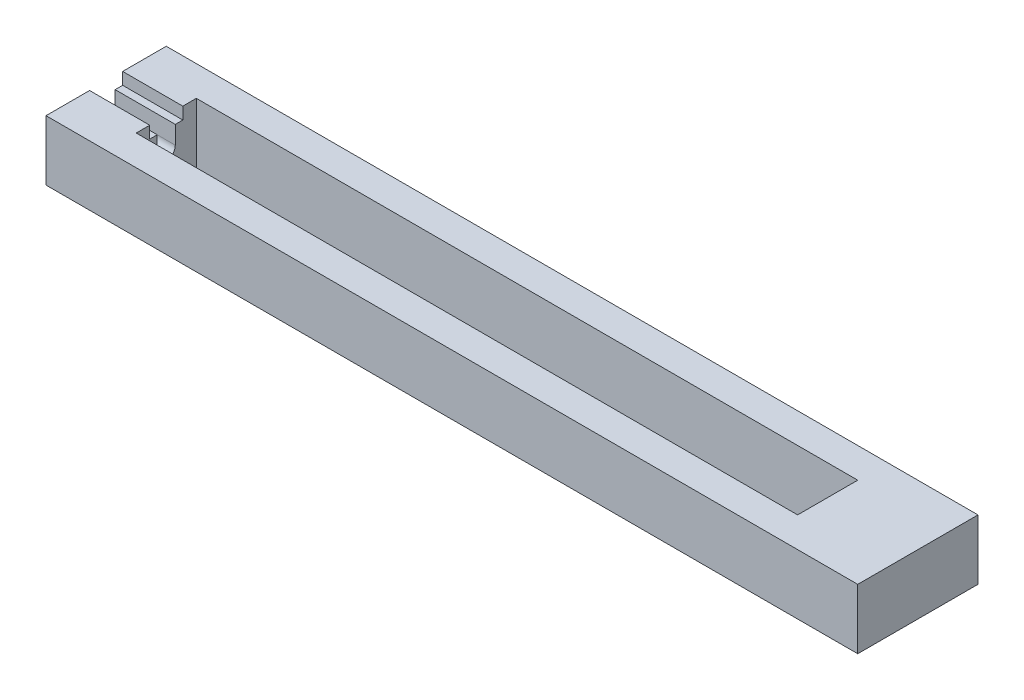
ISO-10303-21;
HEADER;
FILE_DESCRIPTION(('STEP AP214'),'2;1');
FILE_NAME('part.step','',(''),(''),'','','');
FILE_SCHEMA(('AUTOMOTIVE_DESIGN { 1 0 10303 214 1 1 1 1 }'));
ENDSEC;
DATA;
#1=APPLICATION_CONTEXT('core data for automotive mechanical design processes');
#2=APPLICATION_PROTOCOL_DEFINITION('international standard','automotive_design',2000,#1);
#3=PRODUCT_CONTEXT('',#1,'mechanical');
#4=PRODUCT('Part','Part','',(#3));
#5=PRODUCT_RELATED_PRODUCT_CATEGORY('part','',(#4));
#6=PRODUCT_DEFINITION_FORMATION('','',#4);
#7=PRODUCT_DEFINITION_CONTEXT('part definition',#1,'design');
#8=PRODUCT_DEFINITION('design','',#6,#7);
#9=PRODUCT_DEFINITION_SHAPE('','',#8);
#10=(LENGTH_UNIT() NAMED_UNIT(*) SI_UNIT(.MILLI.,.METRE.));
#11=(NAMED_UNIT(*) PLANE_ANGLE_UNIT() SI_UNIT($,.RADIAN.));
#12=(NAMED_UNIT(*) SI_UNIT($,.STERADIAN.) SOLID_ANGLE_UNIT());
#13=UNCERTAINTY_MEASURE_WITH_UNIT(LENGTH_MEASURE(1.E-05),#10,'distance_accuracy_value','');
#14=(GEOMETRIC_REPRESENTATION_CONTEXT(3) GLOBAL_UNCERTAINTY_ASSIGNED_CONTEXT((#13)) GLOBAL_UNIT_ASSIGNED_CONTEXT((#10,
#11,#12)) REPRESENTATION_CONTEXT('',''));
#15=CARTESIAN_POINT('',(0.,0.,0.));
#16=DIRECTION('',(0.,0.,1.));
#17=DIRECTION('',(1.,0.,0.));
#18=AXIS2_PLACEMENT_3D('',#15,#16,#17);
#19=CARTESIAN_POINT('',(0.,1.,0.));
#20=DIRECTION('',(0.,-1.,0.));
#21=DIRECTION('',(0.,0.,-1.));
#22=AXIS2_PLACEMENT_3D('',#19,#20,#21);
#23=PLANE('',#22);
#24=DIRECTION('',(-1.,0.,0.));
#25=VECTOR('',#24,1.);
#26=CARTESIAN_POINT('',(-5.75,1.,-0.275));
#27=LINE('',#26,#25);
#28=CARTESIAN_POINT('',(-5.75,1.,-0.275));
#29=VERTEX_POINT('',#28);
#30=CARTESIAN_POINT('',(-6.75,1.,-0.275));
#31=VERTEX_POINT('',#30);
#32=EDGE_CURVE('E202',#29,#31,#27,.T.);
#33=ORIENTED_EDGE('',*,*,#32,.F.);
#34=DIRECTION('',(0.,0.,1.));
#35=VECTOR('',#34,1.);
#36=CARTESIAN_POINT('',(-5.75,1.,-0.5));
#37=LINE('',#36,#35);
#38=CARTESIAN_POINT('',(-5.75,1.,-0.5));
#39=VERTEX_POINT('',#38);
#40=EDGE_CURVE('E217',#39,#29,#37,.T.);
#41=ORIENTED_EDGE('',*,*,#40,.F.);
#42=DIRECTION('',(-1.,0.,0.));
#43=VECTOR('',#42,1.);
#44=CARTESIAN_POINT('',(-5.75,1.,-0.5));
#45=LINE('',#44,#43);
#46=CARTESIAN_POINT('',(5.25,1.,-0.5));
#47=VERTEX_POINT('',#46);
#48=EDGE_CURVE('E214',#47,#39,#45,.T.);
#49=ORIENTED_EDGE('',*,*,#48,.F.);
#50=DIRECTION('',(0.,0.,-1.));
#51=VECTOR('',#50,1.);
#52=CARTESIAN_POINT('',(5.25,1.,-0.5));
#53=LINE('',#52,#51);
#54=CARTESIAN_POINT('',(5.25,1.,0.5));
#55=VERTEX_POINT('',#54);
#56=EDGE_CURVE('E212',#55,#47,#53,.T.);
#57=ORIENTED_EDGE('',*,*,#56,.F.);
#58=DIRECTION('',(1.,0.,0.));
#59=VECTOR('',#58,1.);
#60=CARTESIAN_POINT('',(-5.75,1.,0.5));
#61=LINE('',#60,#59);
#62=CARTESIAN_POINT('',(-5.75,1.,0.5));
#63=VERTEX_POINT('',#62);
#64=EDGE_CURVE('E219',#63,#55,#61,.T.);
#65=ORIENTED_EDGE('',*,*,#64,.F.);
#66=CARTESIAN_POINT('',(-5.75,1.,0.275));
#67=VERTEX_POINT('',#66);
#68=EDGE_CURVE('E56',#67,#63,#37,.T.);
#69=ORIENTED_EDGE('',*,*,#68,.F.);
#70=DIRECTION('',(-1.,0.,0.));
#71=VECTOR('',#70,1.);
#72=CARTESIAN_POINT('',(-5.75,1.,0.275));
#73=LINE('',#72,#71);
#74=CARTESIAN_POINT('',(-6.75,1.,0.275));
#75=VERTEX_POINT('',#74);
#76=EDGE_CURVE('E204',#67,#75,#73,.T.);
#77=ORIENTED_EDGE('',*,*,#76,.T.);
#78=DIRECTION('',(0.,0.,1.));
#79=VECTOR('',#78,1.);
#80=CARTESIAN_POINT('',(-6.75,1.,1.));
#81=LINE('',#80,#79);
#82=CARTESIAN_POINT('',(-6.75,1.,1.));
#83=VERTEX_POINT('',#82);
#84=EDGE_CURVE('E248',#75,#83,#81,.T.);
#85=ORIENTED_EDGE('',*,*,#84,.T.);
#86=DIRECTION('',(1.,0.,0.));
#87=VECTOR('',#86,1.);
#88=CARTESIAN_POINT('',(-6.75,1.,1.));
#89=LINE('',#88,#87);
#90=CARTESIAN_POINT('',(6.75,1.,1.));
#91=VERTEX_POINT('',#90);
#92=EDGE_CURVE('E252',#83,#91,#89,.T.);
#93=ORIENTED_EDGE('',*,*,#92,.T.);
#94=DIRECTION('',(0.,0.,-1.));
#95=VECTOR('',#94,1.);
#96=CARTESIAN_POINT('',(6.75,1.,1.));
#97=LINE('',#96,#95);
#98=CARTESIAN_POINT('',(6.75,1.,-1.));
#99=VERTEX_POINT('',#98);
#100=EDGE_CURVE('E242',#91,#99,#97,.T.);
#101=ORIENTED_EDGE('',*,*,#100,.T.);
#102=DIRECTION('',(-1.,0.,0.));
#103=VECTOR('',#102,1.);
#104=CARTESIAN_POINT('',(-6.75,1.,-1.));
#105=LINE('',#104,#103);
#106=CARTESIAN_POINT('',(-6.75,1.,-1.));
#107=VERTEX_POINT('',#106);
#108=EDGE_CURVE('E245',#99,#107,#105,.T.);
#109=ORIENTED_EDGE('',*,*,#108,.T.);
#110=EDGE_CURVE('E249',#107,#31,#81,.T.);
#111=ORIENTED_EDGE('',*,*,#110,.T.);
#112=EDGE_LOOP('',(#33,#41,#49,#57,#65,#69,#77,#85,#93,#101,#109,#111));
#113=FACE_BOUND('',#112,.T.);
#114=ADVANCED_FACE('F33',(#113),#23,.F.);
#115=CARTESIAN_POINT('',(-6.75,1.,1.));
#116=DIRECTION('',(1.,0.,0.));
#117=DIRECTION('',(0.,0.,-1.));
#118=AXIS2_PLACEMENT_3D('',#115,#116,#117);
#119=PLANE('',#118);
#120=DIRECTION('',(0.,1.,0.));
#121=VECTOR('',#120,1.);
#122=CARTESIAN_POINT('',(-6.75,0.,-0.275));
#123=LINE('',#122,#121);
#124=CARTESIAN_POINT('',(-6.75,0.8,-0.275));
#125=VERTEX_POINT('',#124);
#126=EDGE_CURVE('E172',#125,#31,#123,.T.);
#127=ORIENTED_EDGE('',*,*,#126,.T.);
#128=ORIENTED_EDGE('',*,*,#110,.F.);
#129=DIRECTION('',(0.,-1.,0.));
#130=VECTOR('',#129,1.);
#131=CARTESIAN_POINT('',(-6.75,1.,-1.));
#132=LINE('',#131,#130);
#133=CARTESIAN_POINT('',(-6.75,0.,-1.));
#134=VERTEX_POINT('',#133);
#135=EDGE_CURVE('E41',#107,#134,#132,.T.);
#136=ORIENTED_EDGE('',*,*,#135,.T.);
#137=DIRECTION('',(0.,0.,1.));
#138=VECTOR('',#137,1.);
#139=CARTESIAN_POINT('',(-6.75,0.,1.));
#140=LINE('',#139,#138);
#141=CARTESIAN_POINT('',(-6.75,0.,1.));
#142=VERTEX_POINT('',#141);
#143=EDGE_CURVE('E259',#134,#142,#140,.T.);
#144=ORIENTED_EDGE('',*,*,#143,.T.);
#145=DIRECTION('',(0.,-1.,0.));
#146=VECTOR('',#145,1.);
#147=CARTESIAN_POINT('',(-6.75,1.,1.));
#148=LINE('',#147,#146);
#149=EDGE_CURVE('E264',#83,#142,#148,.T.);
#150=ORIENTED_EDGE('',*,*,#149,.F.);
#151=ORIENTED_EDGE('',*,*,#84,.F.);
#152=DIRECTION('',(0.,1.,0.));
#153=VECTOR('',#152,1.);
#154=CARTESIAN_POINT('',(-6.75,0.,0.275));
#155=LINE('',#154,#153);
#156=CARTESIAN_POINT('',(-6.75,0.8,0.275));
#157=VERTEX_POINT('',#156);
#158=EDGE_CURVE('E193',#157,#75,#155,.T.);
#159=ORIENTED_EDGE('',*,*,#158,.F.);
#160=DIRECTION('',(0.,0.,1.));
#161=VECTOR('',#160,1.);
#162=CARTESIAN_POINT('',(-6.75,0.8,0.));
#163=LINE('',#162,#161);
#164=CARTESIAN_POINT('',(-6.75,0.8,0.15));
#165=VERTEX_POINT('',#164);
#166=EDGE_CURVE('E190',#165,#157,#163,.T.);
#167=ORIENTED_EDGE('',*,*,#166,.F.);
#168=DIRECTION('',(0.,1.,0.));
#169=VECTOR('',#168,1.);
#170=CARTESIAN_POINT('',(-6.75,0.,0.15));
#171=LINE('',#170,#169);
#172=CARTESIAN_POINT('',(-6.75,0.5,0.15));
#173=VERTEX_POINT('',#172);
#174=EDGE_CURVE('E187',#173,#165,#171,.T.);
#175=ORIENTED_EDGE('',*,*,#174,.F.);
#176=CARTESIAN_POINT('',(-6.75,0.5,0.));
#177=DIRECTION('',(-1.,0.,0.));
#178=DIRECTION('',(0.,0.,1.));
#179=AXIS2_PLACEMENT_3D('',#176,#177,#178);
#180=CIRCLE('',#179,0.15);
#181=CARTESIAN_POINT('',(-6.75,0.5,-0.15));
#182=VERTEX_POINT('',#181);
#183=EDGE_CURVE('E185',#182,#173,#180,.T.);
#184=ORIENTED_EDGE('',*,*,#183,.F.);
#185=DIRECTION('',(0.,1.,0.));
#186=VECTOR('',#185,1.);
#187=CARTESIAN_POINT('',(-6.75,0.,-0.15));
#188=LINE('',#187,#186);
#189=CARTESIAN_POINT('',(-6.75,0.8,-0.15));
#190=VERTEX_POINT('',#189);
#191=EDGE_CURVE('E153',#182,#190,#188,.T.);
#192=ORIENTED_EDGE('',*,*,#191,.T.);
#193=DIRECTION('',(0.,0.,1.));
#194=VECTOR('',#193,1.);
#195=CARTESIAN_POINT('',(-6.75,0.8,0.));
#196=LINE('',#195,#194);
#197=EDGE_CURVE('E169',#125,#190,#196,.T.);
#198=ORIENTED_EDGE('',*,*,#197,.F.);
#199=EDGE_LOOP('',(#127,#128,#136,#144,#150,#151,#159,#167,#175,#184,#192,#198));
#200=FACE_BOUND('',#199,.T.);
#201=ADVANCED_FACE('F271',(#200),#119,.F.);
#202=CARTESIAN_POINT('',(-5.75,1.,-0.5));
#203=DIRECTION('',(1.,0.,0.));
#204=DIRECTION('',(0.,0.,-1.));
#205=AXIS2_PLACEMENT_3D('',#202,#203,#204);
#206=PLANE('',#205);
#207=ORIENTED_EDGE('',*,*,#40,.T.);
#208=DIRECTION('',(0.,1.,0.));
#209=VECTOR('',#208,1.);
#210=CARTESIAN_POINT('',(-5.75,0.,-0.275));
#211=LINE('',#210,#209);
#212=CARTESIAN_POINT('',(-5.75,0.8,-0.275));
#213=VERTEX_POINT('',#212);
#214=EDGE_CURVE('E181',#213,#29,#211,.T.);
#215=ORIENTED_EDGE('',*,*,#214,.F.);
#216=DIRECTION('',(0.,0.,1.));
#217=VECTOR('',#216,1.);
#218=CARTESIAN_POINT('',(-5.75,0.8,0.));
#219=LINE('',#218,#217);
#220=CARTESIAN_POINT('',(-5.75,0.8,-0.15));
#221=VERTEX_POINT('',#220);
#222=EDGE_CURVE('E158',#213,#221,#219,.T.);
#223=ORIENTED_EDGE('',*,*,#222,.T.);
#224=DIRECTION('',(0.,1.,0.));
#225=VECTOR('',#224,1.);
#226=CARTESIAN_POINT('',(-5.75,0.,-0.15));
#227=LINE('',#226,#225);
#228=CARTESIAN_POINT('',(-5.75,0.5,-0.15));
#229=VERTEX_POINT('',#228);
#230=EDGE_CURVE('E150',#229,#221,#227,.T.);
#231=ORIENTED_EDGE('',*,*,#230,.F.);
#232=CARTESIAN_POINT('',(-5.75,0.5,0.));
#233=DIRECTION('',(-1.,0.,0.));
#234=DIRECTION('',(0.,0.,1.));
#235=AXIS2_PLACEMENT_3D('',#232,#233,#234);
#236=CIRCLE('',#235,0.15);
#237=CARTESIAN_POINT('',(-5.75,0.5,0.15));
#238=VERTEX_POINT('',#237);
#239=EDGE_CURVE('E161',#229,#238,#236,.T.);
#240=ORIENTED_EDGE('',*,*,#239,.T.);
#241=DIRECTION('',(0.,1.,0.));
#242=VECTOR('',#241,1.);
#243=CARTESIAN_POINT('',(-5.75,0.,0.15));
#244=LINE('',#243,#242);
#245=CARTESIAN_POINT('',(-5.75,0.8,0.15));
#246=VERTEX_POINT('',#245);
#247=EDGE_CURVE('E48',#238,#246,#244,.T.);
#248=ORIENTED_EDGE('',*,*,#247,.T.);
#249=DIRECTION('',(0.,0.,1.));
#250=VECTOR('',#249,1.);
#251=CARTESIAN_POINT('',(-5.75,0.8,0.));
#252=LINE('',#251,#250);
#253=CARTESIAN_POINT('',(-5.75,0.8,0.275));
#254=VERTEX_POINT('',#253);
#255=EDGE_CURVE('E176',#246,#254,#252,.T.);
#256=ORIENTED_EDGE('',*,*,#255,.T.);
#257=DIRECTION('',(0.,1.,0.));
#258=VECTOR('',#257,1.);
#259=CARTESIAN_POINT('',(-5.75,0.,0.275));
#260=LINE('',#259,#258);
#261=EDGE_CURVE('E179',#254,#67,#260,.T.);
#262=ORIENTED_EDGE('',*,*,#261,.T.);
#263=ORIENTED_EDGE('',*,*,#68,.T.);
#264=DIRECTION('',(0.,-1.,0.));
#265=VECTOR('',#264,1.);
#266=CARTESIAN_POINT('',(-5.75,1.,0.5));
#267=LINE('',#266,#265);
#268=CARTESIAN_POINT('',(-5.75,0.,0.5));
#269=VERTEX_POINT('',#268);
#270=EDGE_CURVE('E234',#63,#269,#267,.T.);
#271=ORIENTED_EDGE('',*,*,#270,.T.);
#272=DIRECTION('',(0.,0.,1.));
#273=VECTOR('',#272,1.);
#274=CARTESIAN_POINT('',(-5.75,0.,-0.5));
#275=LINE('',#274,#273);
#276=CARTESIAN_POINT('',(-5.75,0.,-0.5));
#277=VERTEX_POINT('',#276);
#278=EDGE_CURVE('E227',#277,#269,#275,.T.);
#279=ORIENTED_EDGE('',*,*,#278,.F.);
#280=DIRECTION('',(0.,-1.,0.));
#281=VECTOR('',#280,1.);
#282=CARTESIAN_POINT('',(-5.75,1.,-0.5));
#283=LINE('',#282,#281);
#284=EDGE_CURVE('E236',#39,#277,#283,.T.);
#285=ORIENTED_EDGE('',*,*,#284,.F.);
#286=EDGE_LOOP('',(#207,#215,#223,#231,#240,#248,#256,#262,#263,#271,#279,#285));
#287=FACE_BOUND('',#286,.T.);
#288=ADVANCED_FACE('F166',(#287),#206,.T.);
#289=CARTESIAN_POINT('',(0.,0.,0.));
#290=DIRECTION('',(0.,-1.,0.));
#291=DIRECTION('',(0.,0.,-1.));
#292=AXIS2_PLACEMENT_3D('',#289,#290,#291);
#293=PLANE('',#292);
#294=DIRECTION('',(0.,0.,-1.));
#295=VECTOR('',#294,1.);
#296=CARTESIAN_POINT('',(6.75,0.,1.));
#297=LINE('',#296,#295);
#298=CARTESIAN_POINT('',(6.75,0.,1.));
#299=VERTEX_POINT('',#298);
#300=CARTESIAN_POINT('',(6.75,0.,-1.));
#301=VERTEX_POINT('',#300);
#302=EDGE_CURVE('E241',#299,#301,#297,.T.);
#303=ORIENTED_EDGE('',*,*,#302,.F.);
#304=DIRECTION('',(1.,0.,0.));
#305=VECTOR('',#304,1.);
#306=CARTESIAN_POINT('',(-6.75,0.,1.));
#307=LINE('',#306,#305);
#308=EDGE_CURVE('E246',#142,#299,#307,.T.);
#309=ORIENTED_EDGE('',*,*,#308,.F.);
#310=ORIENTED_EDGE('',*,*,#143,.F.);
#311=DIRECTION('',(-1.,0.,0.));
#312=VECTOR('',#311,1.);
#313=CARTESIAN_POINT('',(-6.75,0.,-1.));
#314=LINE('',#313,#312);
#315=EDGE_CURVE('E257',#301,#134,#314,.T.);
#316=ORIENTED_EDGE('',*,*,#315,.F.);
#317=EDGE_LOOP('',(#303,#309,#310,#316));
#318=FACE_BOUND('',#317,.T.);
#319=DIRECTION('',(1.,0.,0.));
#320=VECTOR('',#319,1.);
#321=CARTESIAN_POINT('',(-5.75,0.,0.5));
#322=LINE('',#321,#320);
#323=CARTESIAN_POINT('',(5.25,0.,0.5));
#324=VERTEX_POINT('',#323);
#325=EDGE_CURVE('E215',#269,#324,#322,.T.);
#326=ORIENTED_EDGE('',*,*,#325,.T.);
#327=DIRECTION('',(0.,0.,-1.));
#328=VECTOR('',#327,1.);
#329=CARTESIAN_POINT('',(5.25,0.,-0.5));
#330=LINE('',#329,#328);
#331=CARTESIAN_POINT('',(5.25,0.,-0.5));
#332=VERTEX_POINT('',#331);
#333=EDGE_CURVE('E199',#324,#332,#330,.T.);
#334=ORIENTED_EDGE('',*,*,#333,.T.);
#335=DIRECTION('',(-1.,0.,0.));
#336=VECTOR('',#335,1.);
#337=CARTESIAN_POINT('',(-5.75,0.,-0.5));
#338=LINE('',#337,#336);
#339=EDGE_CURVE('E224',#332,#277,#338,.T.);
#340=ORIENTED_EDGE('',*,*,#339,.T.);
#341=ORIENTED_EDGE('',*,*,#278,.T.);
#342=EDGE_LOOP('',(#326,#334,#340,#341));
#343=FACE_BOUND('',#342,.T.);
#344=ADVANCED_FACE('F277',(#318,#343),#293,.T.);
#345=CARTESIAN_POINT('',(6.75,1.,1.));
#346=DIRECTION('',(-1.,0.,0.));
#347=DIRECTION('',(0.,0.,1.));
#348=AXIS2_PLACEMENT_3D('',#345,#346,#347);
#349=PLANE('',#348);
#350=ORIENTED_EDGE('',*,*,#302,.T.);
#351=DIRECTION('',(0.,-1.,0.));
#352=VECTOR('',#351,1.);
#353=CARTESIAN_POINT('',(6.75,1.,-1.));
#354=LINE('',#353,#352);
#355=EDGE_CURVE('E11',#99,#301,#354,.T.);
#356=ORIENTED_EDGE('',*,*,#355,.F.);
#357=ORIENTED_EDGE('',*,*,#100,.F.);
#358=DIRECTION('',(0.,-1.,0.));
#359=VECTOR('',#358,1.);
#360=CARTESIAN_POINT('',(6.75,1.,1.));
#361=LINE('',#360,#359);
#362=EDGE_CURVE('E254',#91,#299,#361,.T.);
#363=ORIENTED_EDGE('',*,*,#362,.T.);
#364=EDGE_LOOP('',(#350,#356,#357,#363));
#365=FACE_BOUND('',#364,.T.);
#366=ADVANCED_FACE('F35',(#365),#349,.F.);
#367=CARTESIAN_POINT('',(-6.75,1.,-1.));
#368=DIRECTION('',(0.,0.,1.));
#369=DIRECTION('',(1.,0.,0.));
#370=AXIS2_PLACEMENT_3D('',#367,#368,#369);
#371=PLANE('',#370);
#372=ORIENTED_EDGE('',*,*,#315,.T.);
#373=ORIENTED_EDGE('',*,*,#135,.F.);
#374=ORIENTED_EDGE('',*,*,#108,.F.);
#375=ORIENTED_EDGE('',*,*,#355,.T.);
#376=EDGE_LOOP('',(#372,#373,#374,#375));
#377=FACE_BOUND('',#376,.T.);
#378=ADVANCED_FACE('F326',(#377),#371,.F.);
#379=CARTESIAN_POINT('',(-6.75,1.,1.));
#380=DIRECTION('',(0.,0.,-1.));
#381=DIRECTION('',(-1.,0.,0.));
#382=AXIS2_PLACEMENT_3D('',#379,#380,#381);
#383=PLANE('',#382);
#384=ORIENTED_EDGE('',*,*,#308,.T.);
#385=ORIENTED_EDGE('',*,*,#362,.F.);
#386=ORIENTED_EDGE('',*,*,#92,.F.);
#387=ORIENTED_EDGE('',*,*,#149,.T.);
#388=EDGE_LOOP('',(#384,#385,#386,#387));
#389=FACE_BOUND('',#388,.T.);
#390=ADVANCED_FACE('F281',(#389),#383,.F.);
#391=CARTESIAN_POINT('',(5.25,1.,-0.5));
#392=DIRECTION('',(-1.,0.,0.));
#393=DIRECTION('',(0.,0.,1.));
#394=AXIS2_PLACEMENT_3D('',#391,#392,#393);
#395=PLANE('',#394);
#396=ORIENTED_EDGE('',*,*,#333,.F.);
#397=DIRECTION('',(0.,-1.,0.));
#398=VECTOR('',#397,1.);
#399=CARTESIAN_POINT('',(5.25,1.,0.5));
#400=LINE('',#399,#398);
#401=EDGE_CURVE('E221',#55,#324,#400,.T.);
#402=ORIENTED_EDGE('',*,*,#401,.F.);
#403=ORIENTED_EDGE('',*,*,#56,.T.);
#404=DIRECTION('',(0.,-1.,0.));
#405=VECTOR('',#404,1.);
#406=CARTESIAN_POINT('',(5.25,1.,-0.5));
#407=LINE('',#406,#405);
#408=EDGE_CURVE('E238',#47,#332,#407,.T.);
#409=ORIENTED_EDGE('',*,*,#408,.T.);
#410=EDGE_LOOP('',(#396,#402,#403,#409));
#411=FACE_BOUND('',#410,.T.);
#412=ADVANCED_FACE('F316',(#411),#395,.T.);
#413=CARTESIAN_POINT('',(-5.75,1.,-0.5));
#414=DIRECTION('',(0.,0.,1.));
#415=DIRECTION('',(1.,0.,0.));
#416=AXIS2_PLACEMENT_3D('',#413,#414,#415);
#417=PLANE('',#416);
#418=ORIENTED_EDGE('',*,*,#339,.F.);
#419=ORIENTED_EDGE('',*,*,#408,.F.);
#420=ORIENTED_EDGE('',*,*,#48,.T.);
#421=ORIENTED_EDGE('',*,*,#284,.T.);
#422=EDGE_LOOP('',(#418,#419,#420,#421));
#423=FACE_BOUND('',#422,.T.);
#424=ADVANCED_FACE('F310',(#423),#417,.T.);
#425=CARTESIAN_POINT('',(-5.75,1.,0.5));
#426=DIRECTION('',(0.,0.,-1.));
#427=DIRECTION('',(-1.,0.,0.));
#428=AXIS2_PLACEMENT_3D('',#425,#426,#427);
#429=PLANE('',#428);
#430=ORIENTED_EDGE('',*,*,#325,.F.);
#431=ORIENTED_EDGE('',*,*,#270,.F.);
#432=ORIENTED_EDGE('',*,*,#64,.T.);
#433=ORIENTED_EDGE('',*,*,#401,.T.);
#434=EDGE_LOOP('',(#430,#431,#432,#433));
#435=FACE_BOUND('',#434,.T.);
#436=ADVANCED_FACE('F319',(#435),#429,.T.);
#437=CARTESIAN_POINT('',(-5.75,0.,-0.15));
#438=DIRECTION('',(0.,0.,1.));
#439=DIRECTION('',(1.,0.,0.));
#440=AXIS2_PLACEMENT_3D('',#437,#438,#439);
#441=PLANE('',#440);
#442=ORIENTED_EDGE('',*,*,#191,.F.);
#443=DIRECTION('',(-1.,0.,0.));
#444=VECTOR('',#443,1.);
#445=CARTESIAN_POINT('',(-5.75,0.5,-0.15));
#446=LINE('',#445,#444);
#447=EDGE_CURVE('E146',#229,#182,#446,.T.);
#448=ORIENTED_EDGE('',*,*,#447,.F.);
#449=ORIENTED_EDGE('',*,*,#230,.T.);
#450=DIRECTION('',(-1.,0.,0.));
#451=VECTOR('',#450,1.);
#452=CARTESIAN_POINT('',(-5.75,0.8,-0.15));
#453=LINE('',#452,#451);
#454=EDGE_CURVE('E197',#221,#190,#453,.T.);
#455=ORIENTED_EDGE('',*,*,#454,.T.);
#456=EDGE_LOOP('',(#442,#448,#449,#455));
#457=FACE_BOUND('',#456,.T.);
#458=ADVANCED_FACE('F148',(#457),#441,.T.);
#459=CARTESIAN_POINT('',(-5.75,0.8,0.));
#460=DIRECTION('',(0.,-1.,0.));
#461=DIRECTION('',(0.,0.,-1.));
#462=AXIS2_PLACEMENT_3D('',#459,#460,#461);
#463=PLANE('',#462);
#464=ORIENTED_EDGE('',*,*,#197,.T.);
#465=ORIENTED_EDGE('',*,*,#454,.F.);
#466=ORIENTED_EDGE('',*,*,#222,.F.);
#467=DIRECTION('',(-1.,0.,0.));
#468=VECTOR('',#467,1.);
#469=CARTESIAN_POINT('',(-5.75,0.8,-0.275));
#470=LINE('',#469,#468);
#471=EDGE_CURVE('E200',#213,#125,#470,.T.);
#472=ORIENTED_EDGE('',*,*,#471,.T.);
#473=EDGE_LOOP('',(#464,#465,#466,#472));
#474=FACE_BOUND('',#473,.T.);
#475=ADVANCED_FACE('F302',(#474),#463,.F.);
#476=CARTESIAN_POINT('',(-5.75,0.,-0.275));
#477=DIRECTION('',(0.,0.,1.));
#478=DIRECTION('',(1.,0.,0.));
#479=AXIS2_PLACEMENT_3D('',#476,#477,#478);
#480=PLANE('',#479);
#481=ORIENTED_EDGE('',*,*,#126,.F.);
#482=ORIENTED_EDGE('',*,*,#471,.F.);
#483=ORIENTED_EDGE('',*,*,#214,.T.);
#484=ORIENTED_EDGE('',*,*,#32,.T.);
#485=EDGE_LOOP('',(#481,#482,#483,#484));
#486=FACE_BOUND('',#485,.T.);
#487=ADVANCED_FACE('F304',(#486),#480,.T.);
#488=CARTESIAN_POINT('',(-5.75,0.,0.275));
#489=DIRECTION('',(0.,0.,1.));
#490=DIRECTION('',(1.,0.,0.));
#491=AXIS2_PLACEMENT_3D('',#488,#489,#490);
#492=PLANE('',#491);
#493=ORIENTED_EDGE('',*,*,#158,.T.);
#494=ORIENTED_EDGE('',*,*,#76,.F.);
#495=ORIENTED_EDGE('',*,*,#261,.F.);
#496=DIRECTION('',(-1.,0.,0.));
#497=VECTOR('',#496,1.);
#498=CARTESIAN_POINT('',(-5.75,0.8,0.275));
#499=LINE('',#498,#497);
#500=EDGE_CURVE('E207',#254,#157,#499,.T.);
#501=ORIENTED_EDGE('',*,*,#500,.T.);
#502=EDGE_LOOP('',(#493,#494,#495,#501));
#503=FACE_BOUND('',#502,.T.);
#504=ADVANCED_FACE('F293',(#503),#492,.F.);
#505=CARTESIAN_POINT('',(-5.75,0.8,0.));
#506=DIRECTION('',(0.,-1.,0.));
#507=DIRECTION('',(0.,0.,-1.));
#508=AXIS2_PLACEMENT_3D('',#505,#506,#507);
#509=PLANE('',#508);
#510=ORIENTED_EDGE('',*,*,#166,.T.);
#511=ORIENTED_EDGE('',*,*,#500,.F.);
#512=ORIENTED_EDGE('',*,*,#255,.F.);
#513=DIRECTION('',(-1.,0.,0.));
#514=VECTOR('',#513,1.);
#515=CARTESIAN_POINT('',(-5.75,0.8,0.15));
#516=LINE('',#515,#514);
#517=EDGE_CURVE('E209',#246,#165,#516,.T.);
#518=ORIENTED_EDGE('',*,*,#517,.T.);
#519=EDGE_LOOP('',(#510,#511,#512,#518));
#520=FACE_BOUND('',#519,.T.);
#521=ADVANCED_FACE('F297',(#520),#509,.F.);
#522=CARTESIAN_POINT('',(-5.75,0.,0.15));
#523=DIRECTION('',(0.,0.,1.));
#524=DIRECTION('',(0.,-1.,0.));
#525=AXIS2_PLACEMENT_3D('',#522,#523,#524);
#526=PLANE('',#525);
#527=ORIENTED_EDGE('',*,*,#174,.T.);
#528=ORIENTED_EDGE('',*,*,#517,.F.);
#529=ORIENTED_EDGE('',*,*,#247,.F.);
#530=DIRECTION('',(-1.,0.,0.));
#531=VECTOR('',#530,1.);
#532=CARTESIAN_POINT('',(-5.75,0.5,0.15));
#533=LINE('',#532,#531);
#534=EDGE_CURVE('E157',#238,#173,#533,.T.);
#535=ORIENTED_EDGE('',*,*,#534,.T.);
#536=EDGE_LOOP('',(#527,#528,#529,#535));
#537=FACE_BOUND('',#536,.T.);
#538=ADVANCED_FACE('F298',(#537),#526,.F.);
#539=CARTESIAN_POINT('',(-5.75,0.5,0.));
#540=DIRECTION('',(-1.,0.,0.));
#541=DIRECTION('',(0.,0.,1.));
#542=AXIS2_PLACEMENT_3D('',#539,#540,#541);
#543=CYLINDRICAL_SURFACE('',#542,0.15);
#544=ORIENTED_EDGE('',*,*,#183,.T.);
#545=ORIENTED_EDGE('',*,*,#534,.F.);
#546=ORIENTED_EDGE('',*,*,#239,.F.);
#547=ORIENTED_EDGE('',*,*,#447,.T.);
#548=EDGE_LOOP('',(#544,#545,#546,#547));
#549=FACE_BOUND('',#548,.T.);
#550=ADVANCED_FACE('F162',(#549),#543,.F.);
#551=CLOSED_SHELL('',(#114,#201,#288,#344,#366,#378,#390,#412,#424,#436,#458,#475,#487,#504,
#521,#538,#550));
#552=MANIFOLD_SOLID_BREP('B2',#551);
#553=ADVANCED_BREP_SHAPE_REPRESENTATION('',(#18,#552),#14);
#554=SHAPE_DEFINITION_REPRESENTATION(#9,#553);
ENDSEC;
END-ISO-10303-21;
